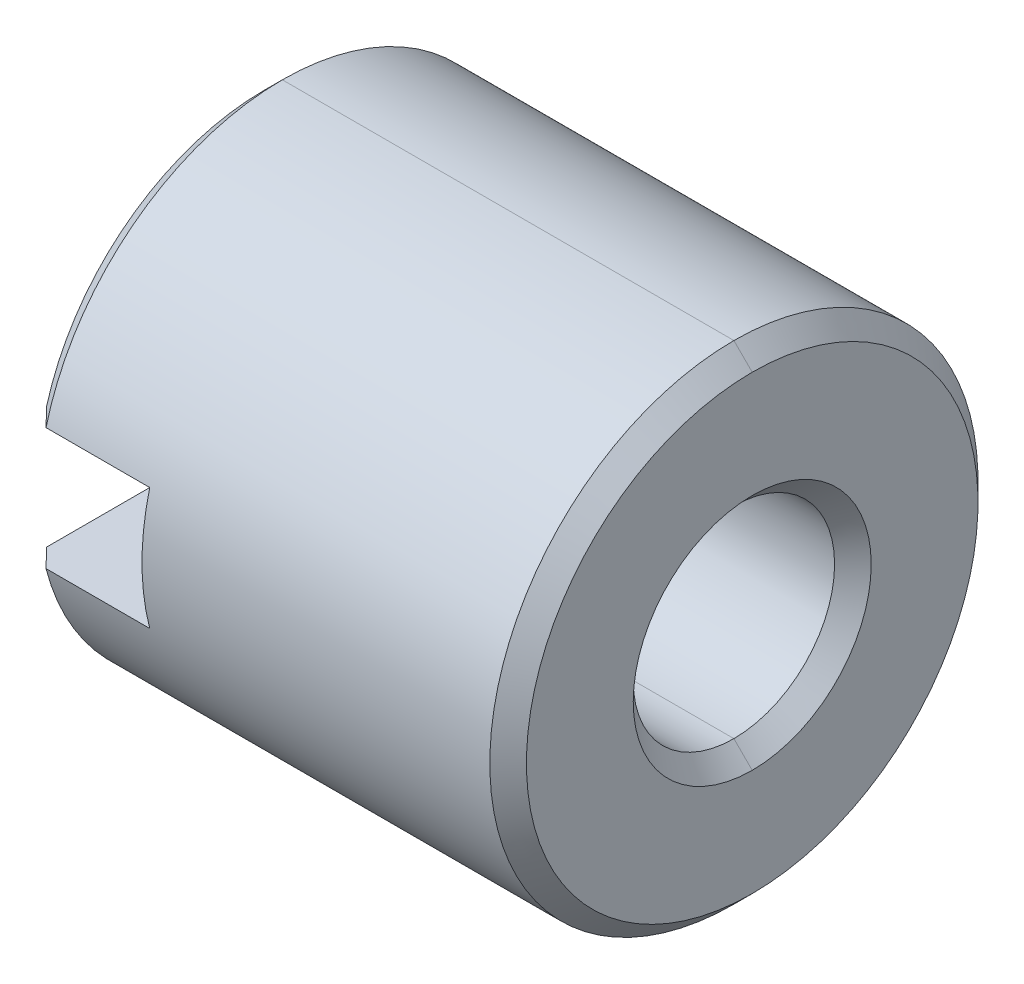
ISO-10303-21;
HEADER;
FILE_DESCRIPTION(('STEP AP214'),'2;1');
FILE_NAME('part.step','',(''),(''),'','','');
FILE_SCHEMA(('AUTOMOTIVE_DESIGN { 1 0 10303 214 1 1 1 1 }'));
ENDSEC;
DATA;
#1=APPLICATION_CONTEXT('core data for automotive mechanical design processes');
#2=APPLICATION_PROTOCOL_DEFINITION('international standard','automotive_design',2000,#1);
#3=PRODUCT_CONTEXT('',#1,'mechanical');
#4=PRODUCT('Part','Part','',(#3));
#5=PRODUCT_RELATED_PRODUCT_CATEGORY('part','',(#4));
#6=PRODUCT_DEFINITION_FORMATION('','',#4);
#7=PRODUCT_DEFINITION_CONTEXT('part definition',#1,'design');
#8=PRODUCT_DEFINITION('design','',#6,#7);
#9=PRODUCT_DEFINITION_SHAPE('','',#8);
#10=(LENGTH_UNIT() NAMED_UNIT(*) SI_UNIT(.MILLI.,.METRE.));
#11=(NAMED_UNIT(*) PLANE_ANGLE_UNIT() SI_UNIT($,.RADIAN.));
#12=(NAMED_UNIT(*) SI_UNIT($,.STERADIAN.) SOLID_ANGLE_UNIT());
#13=UNCERTAINTY_MEASURE_WITH_UNIT(LENGTH_MEASURE(1.E-05),#10,'distance_accuracy_value','');
#14=(GEOMETRIC_REPRESENTATION_CONTEXT(3) GLOBAL_UNCERTAINTY_ASSIGNED_CONTEXT((#13)) GLOBAL_UNIT_ASSIGNED_CONTEXT((#10,
#11,#12)) REPRESENTATION_CONTEXT('',''));
#15=CARTESIAN_POINT('',(0.,0.,0.));
#16=DIRECTION('',(0.,0.,1.));
#17=DIRECTION('',(1.,0.,0.));
#18=AXIS2_PLACEMENT_3D('',#15,#16,#17);
#19=CARTESIAN_POINT('',(7.849999999849,0.,0.));
#20=DIRECTION('',(1.,0.,0.));
#21=DIRECTION('',(0.,0.,-1.));
#22=AXIS2_PLACEMENT_3D('',#19,#20,#21);
#23=CONICAL_SURFACE('',#22,1.799999999849,0.7853981633973);
#24=DIRECTION('',(-0.707106781186548,-0.707106781186548,-8.47484993595657E-10));
#25=VECTOR('',#24,1.);
#26=CARTESIAN_POINT('',(7.999999999813,1.949999999813,9.840526496576E-10));
#27=LINE('',#26,#25);
#28=CARTESIAN_POINT('',(8.,1.95,0.));
#29=VERTEX_POINT('',#28);
#30=CARTESIAN_POINT('',(7.7,1.65,0.));
#31=VERTEX_POINT('',#30);
#32=EDGE_CURVE('P0_E251',#29,#31,#27,.T.);
#33=ORIENTED_EDGE('',*,*,#32,.T.);
#34=CARTESIAN_POINT('',(7.7,0.,0.));
#35=DIRECTION('',(-1.,0.,0.));
#36=DIRECTION('',(0.,1.,0.));
#37=AXIS2_PLACEMENT_3D('',#34,#35,#36);
#38=CIRCLE('',#37,1.65);
#39=CARTESIAN_POINT('',(7.7,-1.65,0.));
#40=VERTEX_POINT('',#39);
#41=EDGE_CURVE('P0_E244',#31,#40,#38,.T.);
#42=ORIENTED_EDGE('',*,*,#41,.T.);
#43=DIRECTION('',(-0.707106781186548,0.707106781186548,8.47486368665657E-10));
#44=VECTOR('',#43,1.);
#45=CARTESIAN_POINT('',(7.999999999813,-1.949999999813,-9.840536468787E-10));
#46=LINE('',#45,#44);
#47=CARTESIAN_POINT('',(8.,-1.95,0.));
#48=VERTEX_POINT('',#47);
#49=EDGE_CURVE('P0_E248',#48,#40,#46,.T.);
#50=ORIENTED_EDGE('',*,*,#49,.F.);
#51=CARTESIAN_POINT('',(8.,0.,0.));
#52=DIRECTION('',(-1.,0.,0.));
#53=DIRECTION('',(0.,1.,0.));
#54=AXIS2_PLACEMENT_3D('',#51,#52,#53);
#55=CIRCLE('',#54,1.95);
#56=EDGE_CURVE('P0_E350',#29,#48,#55,.T.);
#57=ORIENTED_EDGE('',*,*,#56,.F.);
#58=EDGE_LOOP('',(#33,#42,#50,#57));
#59=FACE_BOUND('',#58,.T.);
#60=ADVANCED_FACE('P0_F17',(#59),#23,.F.);
#61=CARTESIAN_POINT('',(7.850000000014,0.,0.));
#62=DIRECTION('',(-1.,0.,0.));
#63=DIRECTION('',(0.,0.,-1.));
#64=AXIS2_PLACEMENT_3D('',#61,#62,#63);
#65=CONICAL_SURFACE('',#64,3.849999999986,0.7853981633973);
#66=DIRECTION('',(-0.707106781186498,-0.707106781186597,2.22109323048799E-10));
#67=VECTOR('',#66,1.);
#68=CARTESIAN_POINT('',(8.000000000015,-3.699999999985,-4.980849783064E-10));
#69=LINE('',#68,#67);
#70=CARTESIAN_POINT('',(8.,-3.7,0.));
#71=VERTEX_POINT('',#70);
#72=CARTESIAN_POINT('',(7.7,-4.,0.));
#73=VERTEX_POINT('',#72);
#74=EDGE_CURVE('P0_E11',#71,#73,#69,.T.);
#75=ORIENTED_EDGE('',*,*,#74,.T.);
#76=CARTESIAN_POINT('',(7.7,0.,0.));
#77=DIRECTION('',(1.,0.,0.));
#78=DIRECTION('',(0.,-1.,0.));
#79=AXIS2_PLACEMENT_3D('',#76,#77,#78);
#80=CIRCLE('',#79,4.);
#81=CARTESIAN_POINT('',(7.7,4.,0.));
#82=VERTEX_POINT('',#81);
#83=EDGE_CURVE('P0_E318',#73,#82,#80,.T.);
#84=ORIENTED_EDGE('',*,*,#83,.T.);
#85=DIRECTION('',(-0.707106781186498,0.707106781186597,-2.22108939297799E-10));
#86=VECTOR('',#85,1.);
#87=CARTESIAN_POINT('',(8.000000000015,3.699999999985,4.980843596545E-10));
#88=LINE('',#87,#86);
#89=CARTESIAN_POINT('',(8.,3.7,0.));
#90=VERTEX_POINT('',#89);
#91=EDGE_CURVE('P0_E25',#90,#82,#88,.T.);
#92=ORIENTED_EDGE('',*,*,#91,.F.);
#93=CARTESIAN_POINT('',(8.,0.,0.));
#94=DIRECTION('',(1.,0.,0.));
#95=DIRECTION('',(0.,-1.,0.));
#96=AXIS2_PLACEMENT_3D('',#93,#94,#95);
#97=CIRCLE('',#96,3.7);
#98=EDGE_CURVE('P0_E283',#71,#90,#97,.T.);
#99=ORIENTED_EDGE('',*,*,#98,.F.);
#100=EDGE_LOOP('',(#75,#84,#92,#99));
#101=FACE_BOUND('',#100,.T.);
#102=ADVANCED_FACE('P0_F477',(#101),#65,.T.);
#103=CARTESIAN_POINT('',(7.850000000014,0.,0.));
#104=DIRECTION('',(-1.,0.,0.));
#105=DIRECTION('',(0.,0.,-1.));
#106=AXIS2_PLACEMENT_3D('',#103,#104,#105);
#107=CONICAL_SURFACE('',#106,3.849999999986,0.7853981633973);
#108=ORIENTED_EDGE('',*,*,#91,.T.);
#109=CARTESIAN_POINT('',(7.7,0.,0.));
#110=DIRECTION('',(1.,0.,0.));
#111=DIRECTION('',(0.,1.,0.));
#112=AXIS2_PLACEMENT_3D('',#109,#110,#111);
#113=CIRCLE('',#112,4.);
#114=EDGE_CURVE('P0_E292',#82,#73,#113,.T.);
#115=ORIENTED_EDGE('',*,*,#114,.T.);
#116=ORIENTED_EDGE('',*,*,#74,.F.);
#117=CARTESIAN_POINT('',(8.,0.,0.));
#118=DIRECTION('',(1.,0.,0.));
#119=DIRECTION('',(0.,1.,0.));
#120=AXIS2_PLACEMENT_3D('',#117,#118,#119);
#121=CIRCLE('',#120,3.7);
#122=EDGE_CURVE('P0_E300',#90,#71,#121,.T.);
#123=ORIENTED_EDGE('',*,*,#122,.F.);
#124=EDGE_LOOP('',(#108,#115,#116,#123));
#125=FACE_BOUND('',#124,.T.);
#126=ADVANCED_FACE('P0_F480',(#125),#107,.T.);
#127=CARTESIAN_POINT('',(8.,0.,0.));
#128=DIRECTION('',(1.,0.,0.));
#129=DIRECTION('',(0.,1.,0.));
#130=AXIS2_PLACEMENT_3D('',#127,#128,#129);
#131=PLANE('',#130);
#132=ORIENTED_EDGE('',*,*,#56,.T.);
#133=CARTESIAN_POINT('',(8.,0.,0.));
#134=DIRECTION('',(-1.,0.,0.));
#135=DIRECTION('',(0.,-1.,0.));
#136=AXIS2_PLACEMENT_3D('',#133,#134,#135);
#137=CIRCLE('',#136,1.95);
#138=EDGE_CURVE('P0_E279',#48,#29,#137,.T.);
#139=ORIENTED_EDGE('',*,*,#138,.T.);
#140=EDGE_LOOP('',(#132,#139));
#141=FACE_BOUND('',#140,.T.);
#142=ORIENTED_EDGE('',*,*,#98,.T.);
#143=ORIENTED_EDGE('',*,*,#122,.T.);
#144=EDGE_LOOP('',(#142,#143));
#145=FACE_BOUND('',#144,.T.);
#146=ADVANCED_FACE('P0_F479',(#141,#145),#131,.T.);
#147=CARTESIAN_POINT('',(7.849999999849,0.,0.));
#148=DIRECTION('',(1.,0.,0.));
#149=DIRECTION('',(0.,0.,-1.));
#150=AXIS2_PLACEMENT_3D('',#147,#148,#149);
#151=CONICAL_SURFACE('',#150,1.799999999849,0.7853981633973);
#152=ORIENTED_EDGE('',*,*,#49,.T.);
#153=CARTESIAN_POINT('',(7.7,0.,0.));
#154=DIRECTION('',(-1.,0.,0.));
#155=DIRECTION('',(0.,-1.,0.));
#156=AXIS2_PLACEMENT_3D('',#153,#154,#155);
#157=CIRCLE('',#156,1.65);
#158=EDGE_CURVE('P0_E252',#40,#31,#157,.T.);
#159=ORIENTED_EDGE('',*,*,#158,.T.);
#160=ORIENTED_EDGE('',*,*,#32,.F.);
#161=ORIENTED_EDGE('',*,*,#138,.F.);
#162=EDGE_LOOP('',(#152,#159,#160,#161));
#163=FACE_BOUND('',#162,.T.);
#164=ADVANCED_FACE('P0_F489',(#163),#151,.F.);
#165=CARTESIAN_POINT('',(-1.24,0.,0.));
#166=DIRECTION('',(1.,0.,0.));
#167=DIRECTION('',(0.,-1.,0.));
#168=AXIS2_PLACEMENT_3D('',#165,#166,#167);
#169=CYLINDRICAL_SURFACE('',#168,1.65);
#170=DIRECTION('',(1.,0.,0.));
#171=VECTOR('',#170,1.);
#172=CARTESIAN_POINT('',(0.3,1.,1.312440474841));
#173=LINE('',#172,#171);
#174=CARTESIAN_POINT('',(0.3,1.,1.312440474841));
#175=VERTEX_POINT('',#174);
#176=CARTESIAN_POINT('',(2.,1.,1.312440474841));
#177=VERTEX_POINT('',#176);
#178=EDGE_CURVE('P0_E310',#175,#177,#173,.T.);
#179=ORIENTED_EDGE('',*,*,#178,.F.);
#180=CARTESIAN_POINT('',(0.3,0.,0.));
#181=DIRECTION('',(1.,0.,0.));
#182=DIRECTION('',(0.,1.,0.));
#183=AXIS2_PLACEMENT_3D('',#180,#181,#182);
#184=CIRCLE('',#183,1.65);
#185=CARTESIAN_POINT('',(0.3000000000792,1.649999999921,4.163304253054E-10));
#186=VERTEX_POINT('',#185);
#187=EDGE_CURVE('P0_E264',#186,#175,#184,.T.);
#188=ORIENTED_EDGE('',*,*,#187,.F.);
#189=DIRECTION('',(1.,-5.354665659966E-12,2.813037741685E-11));
#190=VECTOR('',#189,1.);
#191=CARTESIAN_POINT('',(0.3000000000792,1.649999999921,4.163304253054E-10));
#192=LINE('',#191,#190);
#193=EDGE_CURVE('P0_E271',#186,#31,#192,.T.);
#194=ORIENTED_EDGE('',*,*,#193,.T.);
#195=ORIENTED_EDGE('',*,*,#158,.F.);
#196=DIRECTION('',(1.,5.354665659966E-12,-2.813040474616E-11));
#197=VECTOR('',#196,1.);
#198=CARTESIAN_POINT('',(0.3000000000792,-1.649999999921,-4.163306368968E-10));
#199=LINE('',#198,#197);
#200=CARTESIAN_POINT('',(0.3000000000792,-1.649999999921,-4.163306368968E-10));
#201=VERTEX_POINT('',#200);
#202=EDGE_CURVE('P0_E240',#201,#40,#199,.T.);
#203=ORIENTED_EDGE('',*,*,#202,.F.);
#204=CARTESIAN_POINT('',(0.3,0.,0.));
#205=DIRECTION('',(1.,0.,0.));
#206=DIRECTION('',(0.,-0.606060606060605,0.795418469600406));
#207=AXIS2_PLACEMENT_3D('',#204,#205,#206);
#208=CIRCLE('',#207,1.65);
#209=CARTESIAN_POINT('',(0.3,-1.,1.312440474841));
#210=VERTEX_POINT('',#209);
#211=EDGE_CURVE('P0_E228',#210,#201,#208,.T.);
#212=ORIENTED_EDGE('',*,*,#211,.F.);
#213=DIRECTION('',(1.,0.,0.));
#214=VECTOR('',#213,1.);
#215=CARTESIAN_POINT('',(0.3,-1.,1.312440474841));
#216=LINE('',#215,#214);
#217=CARTESIAN_POINT('',(2.,-1.,1.312440474841));
#218=VERTEX_POINT('',#217);
#219=EDGE_CURVE('P0_E367',#210,#218,#216,.T.);
#220=ORIENTED_EDGE('',*,*,#219,.T.);
#221=CARTESIAN_POINT('',(2.,0.,0.));
#222=DIRECTION('',(1.,0.,0.));
#223=DIRECTION('',(0.,0.606060606060605,0.795418469600406));
#224=AXIS2_PLACEMENT_3D('',#221,#222,#223);
#225=CIRCLE('',#224,1.65);
#226=EDGE_CURVE('P0_E235',#177,#218,#225,.T.);
#227=ORIENTED_EDGE('',*,*,#226,.F.);
#228=EDGE_LOOP('',(#179,#188,#194,#195,#203,#212,#220,#227));
#229=FACE_BOUND('',#228,.T.);
#230=ADVANCED_FACE('P0_F462',(#229),#169,.F.);
#231=CARTESIAN_POINT('',(0.,1.,3.872983346207));
#232=DIRECTION('',(0.,1.,0.));
#233=DIRECTION('',(1.,0.,0.));
#234=AXIS2_PLACEMENT_3D('',#231,#232,#233);
#235=PLANE('',#234);
#236=CARTESIAN_POINT('',(0.3,1.,-3.872983346207));
#237=CARTESIAN_POINT('',(0.2657697355043,1.,-3.837630481053));
#238=CARTESIAN_POINT('',(0.1979063060679,1.,-3.767480929232));
#239=CARTESIAN_POINT('',(0.09791173359971,1.,-3.663929218604));
#240=CARTESIAN_POINT('',(0.03243796597576,1.,-3.595994450391));
#241=CARTESIAN_POINT('',(0.,1.,-3.562302626111));
#242=(BOUNDED_CURVE() B_SPLINE_CURVE(3,(#236,#237,#238,#239,#240,#241),.UNSPECIFIED.,.F.,
.F.) B_SPLINE_CURVE_WITH_KNOTS((4,1,1,4),(0.,0.3333333333333,0.6666666666667,1.),
.UNSPECIFIED.) CURVE() GEOMETRIC_REPRESENTATION_ITEM() RATIONAL_B_SPLINE_CURVE((1.,1.,1.,1.,1.,1.)) REPRESENTATION_ITEM(''));
#243=CARTESIAN_POINT('',(0.3,1.,-3.872983346207));
#244=VERTEX_POINT('',#243);
#245=CARTESIAN_POINT('',(0.,1.,-3.562302626111));
#246=VERTEX_POINT('',#245);
#247=EDGE_CURVE('P0_E328',#244,#246,#242,.T.);
#248=ORIENTED_EDGE('',*,*,#247,.F.);
#249=DIRECTION('',(1.,0.,0.));
#250=VECTOR('',#249,1.);
#251=CARTESIAN_POINT('',(0.3,1.,-3.872983346207));
#252=LINE('',#251,#250);
#253=CARTESIAN_POINT('',(2.,1.,-3.872983346207));
#254=VERTEX_POINT('',#253);
#255=EDGE_CURVE('P0_E303',#244,#254,#252,.T.);
#256=ORIENTED_EDGE('',*,*,#255,.T.);
#257=DIRECTION('',(0.,0.,-1.));
#258=VECTOR('',#257,1.);
#259=CARTESIAN_POINT('',(2.,1.,-1.312440474841));
#260=LINE('',#259,#258);
#261=CARTESIAN_POINT('',(2.,1.,-1.312440474841));
#262=VERTEX_POINT('',#261);
#263=EDGE_CURVE('P0_E190',#262,#254,#260,.T.);
#264=ORIENTED_EDGE('',*,*,#263,.F.);
#265=DIRECTION('',(1.,0.,0.));
#266=VECTOR('',#265,1.);
#267=CARTESIAN_POINT('',(0.3,1.,-1.312440474841));
#268=LINE('',#267,#266);
#269=CARTESIAN_POINT('',(0.3,1.,-1.312440474841));
#270=VERTEX_POINT('',#269);
#271=EDGE_CURVE('P0_E275',#270,#262,#268,.T.);
#272=ORIENTED_EDGE('',*,*,#271,.F.);
#273=CARTESIAN_POINT('',(0.3,1.,-1.312440474841));
#274=CARTESIAN_POINT('',(0.2700144693865,1.,-1.350138280159));
#275=CARTESIAN_POINT('',(0.207791121413,1.,-1.427171375861));
#276=CARTESIAN_POINT('',(0.1078224656772,1.,-1.547611652264));
#277=CARTESIAN_POINT('',(0.03667734501383,1.,-1.631344105928));
#278=CARTESIAN_POINT('',(0.,1.,-1.674066904278));
#279=(BOUNDED_CURVE() B_SPLINE_CURVE(3,(#273,#274,#275,#276,#277,#278),.UNSPECIFIED.,.F.,
.F.) B_SPLINE_CURVE_WITH_KNOTS((4,1,1,4),(0.,0.3333333333333,0.6666666666667,1.),
.UNSPECIFIED.) CURVE() GEOMETRIC_REPRESENTATION_ITEM() RATIONAL_B_SPLINE_CURVE((1.,1.,1.,1.,1.,1.)) REPRESENTATION_ITEM(''));
#280=CARTESIAN_POINT('',(0.,1.,-1.674066904278));
#281=VERTEX_POINT('',#280);
#282=EDGE_CURVE('P0_E247',#270,#281,#279,.T.);
#283=ORIENTED_EDGE('',*,*,#282,.T.);
#284=DIRECTION('',(0.,0.,-1.));
#285=VECTOR('',#284,1.);
#286=CARTESIAN_POINT('',(0.,1.,-1.674066904278));
#287=LINE('',#286,#285);
#288=EDGE_CURVE('P0_E417',#281,#246,#287,.T.);
#289=ORIENTED_EDGE('',*,*,#288,.T.);
#290=EDGE_LOOP('',(#248,#256,#264,#272,#283,#289));
#291=FACE_BOUND('',#290,.T.);
#292=ADVANCED_FACE('P0_F470',(#291),#235,.F.);
#293=CARTESIAN_POINT('',(0.,1.,3.872983346207));
#294=DIRECTION('',(0.,1.,0.));
#295=DIRECTION('',(1.,0.,0.));
#296=AXIS2_PLACEMENT_3D('',#293,#294,#295);
#297=PLANE('',#296);
#298=CARTESIAN_POINT('',(0.,1.,1.674066904278));
#299=CARTESIAN_POINT('',(0.03660845489877,1.,1.631424351062));
#300=CARTESIAN_POINT('',(0.1076635162363,1.,1.547800174312));
#301=CARTESIAN_POINT('',(0.2076454283079,1.,1.427349857706));
#302=CARTESIAN_POINT('',(0.2699530564767,1.,1.350215488461));
#303=CARTESIAN_POINT('',(0.3,1.,1.312440474841));
#304=(BOUNDED_CURVE() B_SPLINE_CURVE(3,(#298,#299,#300,#301,#302,#303),.UNSPECIFIED.,.F.,
.F.) B_SPLINE_CURVE_WITH_KNOTS((4,1,1,4),(0.,0.3333333333333,0.6666666666667,1.),
.UNSPECIFIED.) CURVE() GEOMETRIC_REPRESENTATION_ITEM() RATIONAL_B_SPLINE_CURVE((1.,1.,1.,1.,1.,1.)) REPRESENTATION_ITEM(''));
#305=CARTESIAN_POINT('',(0.,1.,1.674066904278));
#306=VERTEX_POINT('',#305);
#307=EDGE_CURVE('P0_E219',#306,#175,#304,.T.);
#308=ORIENTED_EDGE('',*,*,#307,.T.);
#309=ORIENTED_EDGE('',*,*,#178,.T.);
#310=DIRECTION('',(0.,0.,-1.));
#311=VECTOR('',#310,1.);
#312=CARTESIAN_POINT('',(2.,1.,3.872983346207));
#313=LINE('',#312,#311);
#314=CARTESIAN_POINT('',(2.,1.,3.872983346207));
#315=VERTEX_POINT('',#314);
#316=EDGE_CURVE('P0_E194',#315,#177,#313,.T.);
#317=ORIENTED_EDGE('',*,*,#316,.F.);
#318=DIRECTION('',(1.,0.,0.));
#319=VECTOR('',#318,1.);
#320=CARTESIAN_POINT('',(0.3,1.,3.872983346207));
#321=LINE('',#320,#319);
#322=CARTESIAN_POINT('',(0.3,1.,3.872983346207));
#323=VERTEX_POINT('',#322);
#324=EDGE_CURVE('P0_E346',#323,#315,#321,.T.);
#325=ORIENTED_EDGE('',*,*,#324,.F.);
#326=CARTESIAN_POINT('',(0.,1.,3.562302626111));
#327=CARTESIAN_POINT('',(0.03242757693032,1.,3.595983659767));
#328=CARTESIAN_POINT('',(0.09788746578101,1.,3.663904056762));
#329=CARTESIAN_POINT('',(0.1978816035343,1.,3.767455378529));
#330=CARTESIAN_POINT('',(0.2657591385284,1.,3.837619536544));
#331=CARTESIAN_POINT('',(0.3,1.,3.872983346207));
#332=(BOUNDED_CURVE() B_SPLINE_CURVE(3,(#326,#327,#328,#329,#330,#331),.UNSPECIFIED.,.F.,
.F.) B_SPLINE_CURVE_WITH_KNOTS((4,1,1,4),(0.,0.3333333333333,0.6666666666667,1.),
.UNSPECIFIED.) CURVE() GEOMETRIC_REPRESENTATION_ITEM() RATIONAL_B_SPLINE_CURVE((1.,1.,1.,1.,1.,1.)) REPRESENTATION_ITEM(''));
#333=CARTESIAN_POINT('',(0.,1.,3.562302626111));
#334=VERTEX_POINT('',#333);
#335=EDGE_CURVE('P0_E293',#334,#323,#332,.T.);
#336=ORIENTED_EDGE('',*,*,#335,.F.);
#337=DIRECTION('',(0.,0.,-1.));
#338=VECTOR('',#337,1.);
#339=CARTESIAN_POINT('',(0.,1.,3.562302626111));
#340=LINE('',#339,#338);
#341=EDGE_CURVE('P0_E427',#334,#306,#340,.T.);
#342=ORIENTED_EDGE('',*,*,#341,.T.);
#343=EDGE_LOOP('',(#308,#309,#317,#325,#336,#342));
#344=FACE_BOUND('',#343,.T.);
#345=ADVANCED_FACE('P0_F458',(#344),#297,.F.);
#346=CARTESIAN_POINT('',(0.,0.,0.));
#347=DIRECTION('',(1.,0.,0.));
#348=DIRECTION('',(0.,-1.,0.));
#349=AXIS2_PLACEMENT_3D('',#346,#347,#348);
#350=CYLINDRICAL_SURFACE('',#349,4.);
#351=DIRECTION('',(1.,0.,0.));
#352=VECTOR('',#351,1.);
#353=CARTESIAN_POINT('',(0.3,-1.,3.872983346207));
#354=LINE('',#353,#352);
#355=CARTESIAN_POINT('',(0.3,-1.,3.872983346207));
#356=VERTEX_POINT('',#355);
#357=CARTESIAN_POINT('',(2.,-1.,3.872983346207));
#358=VERTEX_POINT('',#357);
#359=EDGE_CURVE('P0_E434',#356,#358,#354,.T.);
#360=ORIENTED_EDGE('',*,*,#359,.F.);
#361=CARTESIAN_POINT('',(0.3,0.,0.));
#362=DIRECTION('',(-1.,0.,0.));
#363=DIRECTION('',(0.,-1.,0.));
#364=AXIS2_PLACEMENT_3D('',#361,#362,#363);
#365=CIRCLE('',#364,4.);
#366=CARTESIAN_POINT('',(0.299999999992,-3.999999999992,-2.692331161465E-10));
#367=VERTEX_POINT('',#366);
#368=EDGE_CURVE('P0_E325',#367,#356,#365,.T.);
#369=ORIENTED_EDGE('',*,*,#368,.F.);
#370=DIRECTION('',(1.,5.372279198064E-13,-1.819173744096E-11));
#371=VECTOR('',#370,1.);
#372=CARTESIAN_POINT('',(0.299999999992,-3.999999999992,-2.692331161465E-10));
#373=LINE('',#372,#371);
#374=EDGE_CURVE('P0_E321',#367,#73,#373,.T.);
#375=ORIENTED_EDGE('',*,*,#374,.T.);
#376=ORIENTED_EDGE('',*,*,#114,.F.);
#377=DIRECTION('',(1.,-5.372279198064E-13,1.819143579272E-11));
#378=VECTOR('',#377,1.);
#379=CARTESIAN_POINT('',(0.299999999992,3.999999999992,2.692348925033E-10));
#380=LINE('',#379,#378);
#381=CARTESIAN_POINT('',(0.299999999992,3.999999999992,2.692348925033E-10));
#382=VERTEX_POINT('',#381);
#383=EDGE_CURVE('P0_E314',#382,#82,#380,.T.);
#384=ORIENTED_EDGE('',*,*,#383,.F.);
#385=CARTESIAN_POINT('',(0.3,0.,0.));
#386=DIRECTION('',(-1.,0.,0.));
#387=DIRECTION('',(0.,0.249999999999989,0.968245836551857));
#388=AXIS2_PLACEMENT_3D('',#385,#386,#387);
#389=CIRCLE('',#388,4.);
#390=EDGE_CURVE('P0_E289',#323,#382,#389,.T.);
#391=ORIENTED_EDGE('',*,*,#390,.F.);
#392=ORIENTED_EDGE('',*,*,#324,.T.);
#393=CARTESIAN_POINT('',(2.,0.,0.));
#394=DIRECTION('',(1.,0.,0.));
#395=DIRECTION('',(0.,0.249999999999989,0.968245836551857));
#396=AXIS2_PLACEMENT_3D('',#393,#394,#395);
#397=CIRCLE('',#396,4.);
#398=EDGE_CURVE('P0_E296',#315,#358,#397,.T.);
#399=ORIENTED_EDGE('',*,*,#398,.T.);
#400=EDGE_LOOP('',(#360,#369,#375,#376,#384,#391,#392,#399));
#401=FACE_BOUND('',#400,.T.);
#402=ADVANCED_FACE('P0_F453',(#401),#350,.T.);
#403=CARTESIAN_POINT('',(0.15,0.,0.));
#404=DIRECTION('',(1.,0.,0.));
#405=DIRECTION('',(0.,0.,-1.));
#406=AXIS2_PLACEMENT_3D('',#403,#404,#405);
#407=CONICAL_SURFACE('',#406,3.85,0.7853981633973);
#408=ORIENTED_EDGE('',*,*,#247,.T.);
#409=CARTESIAN_POINT('',(0.,0.,0.));
#410=DIRECTION('',(-1.,0.,0.));
#411=DIRECTION('',(0.,0.270270270270301,0.962784493543606));
#412=AXIS2_PLACEMENT_3D('',#409,#410,#411);
#413=CIRCLE('',#412,3.7);
#414=EDGE_CURVE('P0_E402',#334,#246,#413,.T.);
#415=ORIENTED_EDGE('',*,*,#414,.F.);
#416=ORIENTED_EDGE('',*,*,#335,.T.);
#417=ORIENTED_EDGE('',*,*,#390,.T.);
#418=CARTESIAN_POINT('',(0.3,0.,0.));
#419=DIRECTION('',(-1.,0.,0.));
#420=DIRECTION('',(0.,1.,0.));
#421=AXIS2_PLACEMENT_3D('',#418,#419,#420);
#422=CIRCLE('',#421,4.);
#423=EDGE_CURVE('P0_E306',#382,#244,#422,.T.);
#424=ORIENTED_EDGE('',*,*,#423,.T.);
#425=EDGE_LOOP('',(#408,#415,#416,#417,#424));
#426=FACE_BOUND('',#425,.T.);
#427=ADVANCED_FACE('P0_F475',(#426),#407,.T.);
#428=CARTESIAN_POINT('',(0.15,0.,0.));
#429=DIRECTION('',(1.,0.,0.));
#430=DIRECTION('',(0.,0.,-1.));
#431=AXIS2_PLACEMENT_3D('',#428,#429,#430);
#432=CONICAL_SURFACE('',#431,3.85,0.7853981633973);
#433=CARTESIAN_POINT('',(0.,-1.,-3.562302626111));
#434=CARTESIAN_POINT('',(0.03242757693032,-1.,-3.595983659767));
#435=CARTESIAN_POINT('',(0.09788746578101,-1.,-3.663904056762));
#436=CARTESIAN_POINT('',(0.1978816035343,-1.,-3.767455378529));
#437=CARTESIAN_POINT('',(0.2657591385284,-1.,-3.837619536544));
#438=CARTESIAN_POINT('',(0.3,-1.,-3.872983346207));
#439=(BOUNDED_CURVE() B_SPLINE_CURVE(3,(#433,#434,#435,#436,#437,#438),.UNSPECIFIED.,.F.,
.F.) B_SPLINE_CURVE_WITH_KNOTS((4,1,1,4),(0.,0.3333333333333,0.6666666666667,1.),
.UNSPECIFIED.) CURVE() GEOMETRIC_REPRESENTATION_ITEM() RATIONAL_B_SPLINE_CURVE((1.,1.,1.,1.,1.,1.)) REPRESENTATION_ITEM(''));
#440=CARTESIAN_POINT('',(0.,-1.,-3.562302626111));
#441=VERTEX_POINT('',#440);
#442=CARTESIAN_POINT('',(0.3,-1.,-3.872983346207));
#443=VERTEX_POINT('',#442);
#444=EDGE_CURVE('P0_E205',#441,#443,#439,.T.);
#445=ORIENTED_EDGE('',*,*,#444,.T.);
#446=CARTESIAN_POINT('',(0.3,0.,0.));
#447=DIRECTION('',(-1.,0.,0.));
#448=DIRECTION('',(0.,-0.249999999999989,-0.968245836551857));
#449=AXIS2_PLACEMENT_3D('',#446,#447,#448);
#450=CIRCLE('',#449,4.);
#451=EDGE_CURVE('P0_E201',#443,#367,#450,.T.);
#452=ORIENTED_EDGE('',*,*,#451,.T.);
#453=ORIENTED_EDGE('',*,*,#368,.T.);
#454=CARTESIAN_POINT('',(0.3,-1.,3.872983346207));
#455=CARTESIAN_POINT('',(0.2657697355043,-1.,3.837630481053));
#456=CARTESIAN_POINT('',(0.1979063060679,-1.,3.767480929232));
#457=CARTESIAN_POINT('',(0.09791173359971,-1.,3.663929218604));
#458=CARTESIAN_POINT('',(0.03243796597576,-1.,3.595994450391));
#459=CARTESIAN_POINT('',(0.,-1.,3.562302626111));
#460=(BOUNDED_CURVE() B_SPLINE_CURVE(3,(#454,#455,#456,#457,#458,#459),.UNSPECIFIED.,.F.,
.F.) B_SPLINE_CURVE_WITH_KNOTS((4,1,1,4),(0.,0.3333333333333,0.6666666666667,1.),
.UNSPECIFIED.) CURVE() GEOMETRIC_REPRESENTATION_ITEM() RATIONAL_B_SPLINE_CURVE((1.,1.,1.,1.,1.,1.)) REPRESENTATION_ITEM(''));
#461=CARTESIAN_POINT('',(0.,-1.,3.562302626111));
#462=VERTEX_POINT('',#461);
#463=EDGE_CURVE('P0_E433',#356,#462,#460,.T.);
#464=ORIENTED_EDGE('',*,*,#463,.T.);
#465=CARTESIAN_POINT('',(0.,0.,0.));
#466=DIRECTION('',(-1.,0.,0.));
#467=DIRECTION('',(0.,-0.270270270270301,-0.962784493543606));
#468=AXIS2_PLACEMENT_3D('',#465,#466,#467);
#469=CIRCLE('',#468,3.7);
#470=EDGE_CURVE('P0_E400',#441,#462,#469,.T.);
#471=ORIENTED_EDGE('',*,*,#470,.F.);
#472=EDGE_LOOP('',(#445,#452,#453,#464,#471));
#473=FACE_BOUND('',#472,.T.);
#474=ADVANCED_FACE('P0_F532',(#473),#432,.T.);
#475=CARTESIAN_POINT('',(0.,0.,0.));
#476=DIRECTION('',(1.,0.,0.));
#477=DIRECTION('',(0.,-1.,0.));
#478=AXIS2_PLACEMENT_3D('',#475,#476,#477);
#479=CYLINDRICAL_SURFACE('',#478,4.);
#480=ORIENTED_EDGE('',*,*,#255,.F.);
#481=ORIENTED_EDGE('',*,*,#423,.F.);
#482=ORIENTED_EDGE('',*,*,#383,.T.);
#483=ORIENTED_EDGE('',*,*,#83,.F.);
#484=ORIENTED_EDGE('',*,*,#374,.F.);
#485=ORIENTED_EDGE('',*,*,#451,.F.);
#486=DIRECTION('',(1.,0.,0.));
#487=VECTOR('',#486,1.);
#488=CARTESIAN_POINT('',(0.3,-1.,-3.872983346207));
#489=LINE('',#488,#487);
#490=CARTESIAN_POINT('',(2.,-1.,-3.872983346207));
#491=VERTEX_POINT('',#490);
#492=EDGE_CURVE('P0_E197',#443,#491,#489,.T.);
#493=ORIENTED_EDGE('',*,*,#492,.T.);
#494=CARTESIAN_POINT('',(2.,0.,0.));
#495=DIRECTION('',(1.,0.,0.));
#496=DIRECTION('',(0.,-0.249999999999989,-0.968245836551857));
#497=AXIS2_PLACEMENT_3D('',#494,#495,#496);
#498=CIRCLE('',#497,4.);
#499=EDGE_CURVE('P0_E183',#491,#254,#498,.T.);
#500=ORIENTED_EDGE('',*,*,#499,.T.);
#501=EDGE_LOOP('',(#480,#481,#482,#483,#484,#485,#493,#500));
#502=FACE_BOUND('',#501,.T.);
#503=ADVANCED_FACE('P0_F198',(#502),#479,.T.);
#504=CARTESIAN_POINT('',(2.,0.,0.));
#505=DIRECTION('',(-1.,0.,0.));
#506=DIRECTION('',(0.,0.,1.));
#507=AXIS2_PLACEMENT_3D('',#504,#505,#506);
#508=PLANE('',#507);
#509=ORIENTED_EDGE('',*,*,#316,.T.);
#510=ORIENTED_EDGE('',*,*,#226,.T.);
#511=DIRECTION('',(0.,0.,1.));
#512=VECTOR('',#511,1.);
#513=CARTESIAN_POINT('',(2.,-1.,1.312440474841));
#514=LINE('',#513,#512);
#515=EDGE_CURVE('P0_E370',#218,#358,#514,.T.);
#516=ORIENTED_EDGE('',*,*,#515,.T.);
#517=ORIENTED_EDGE('',*,*,#398,.F.);
#518=EDGE_LOOP('',(#509,#510,#516,#517));
#519=FACE_BOUND('',#518,.T.);
#520=ADVANCED_FACE('P0_F448',(#519),#508,.T.);
#521=CARTESIAN_POINT('',(2.,0.,0.));
#522=DIRECTION('',(-1.,0.,0.));
#523=DIRECTION('',(0.,0.,1.));
#524=AXIS2_PLACEMENT_3D('',#521,#522,#523);
#525=PLANE('',#524);
#526=DIRECTION('',(0.,0.,1.));
#527=VECTOR('',#526,1.);
#528=CARTESIAN_POINT('',(2.,-1.,-3.872983346207));
#529=LINE('',#528,#527);
#530=CARTESIAN_POINT('',(2.,-1.,-1.312440474841));
#531=VERTEX_POINT('',#530);
#532=EDGE_CURVE('P0_E188',#491,#531,#529,.T.);
#533=ORIENTED_EDGE('',*,*,#532,.T.);
#534=CARTESIAN_POINT('',(2.,0.,0.));
#535=DIRECTION('',(1.,0.,0.));
#536=DIRECTION('',(0.,-0.606060606060605,-0.795418469600406));
#537=AXIS2_PLACEMENT_3D('',#534,#535,#536);
#538=CIRCLE('',#537,1.65);
#539=EDGE_CURVE('P0_E272',#531,#262,#538,.T.);
#540=ORIENTED_EDGE('',*,*,#539,.T.);
#541=ORIENTED_EDGE('',*,*,#263,.T.);
#542=ORIENTED_EDGE('',*,*,#499,.F.);
#543=EDGE_LOOP('',(#533,#540,#541,#542));
#544=FACE_BOUND('',#543,.T.);
#545=ADVANCED_FACE('P0_F185',(#544),#525,.T.);
#546=CARTESIAN_POINT('',(-1.24,0.,0.));
#547=DIRECTION('',(1.,0.,0.));
#548=DIRECTION('',(0.,-1.,0.));
#549=AXIS2_PLACEMENT_3D('',#546,#547,#548);
#550=CYLINDRICAL_SURFACE('',#549,1.65);
#551=DIRECTION('',(1.,0.,0.));
#552=VECTOR('',#551,1.);
#553=CARTESIAN_POINT('',(0.3,-1.,-1.312440474841));
#554=LINE('',#553,#552);
#555=CARTESIAN_POINT('',(0.3,-1.,-1.312440474841));
#556=VERTEX_POINT('',#555);
#557=EDGE_CURVE('P0_E210',#556,#531,#554,.T.);
#558=ORIENTED_EDGE('',*,*,#557,.F.);
#559=CARTESIAN_POINT('',(0.3,0.,0.));
#560=DIRECTION('',(1.,0.,0.));
#561=DIRECTION('',(0.,-1.,0.));
#562=AXIS2_PLACEMENT_3D('',#559,#560,#561);
#563=CIRCLE('',#562,1.65);
#564=EDGE_CURVE('P0_E239',#201,#556,#563,.T.);
#565=ORIENTED_EDGE('',*,*,#564,.F.);
#566=ORIENTED_EDGE('',*,*,#202,.T.);
#567=ORIENTED_EDGE('',*,*,#41,.F.);
#568=ORIENTED_EDGE('',*,*,#193,.F.);
#569=CARTESIAN_POINT('',(0.3,0.,0.));
#570=DIRECTION('',(1.,0.,0.));
#571=DIRECTION('',(0.,0.606060606060605,-0.795418469600406));
#572=AXIS2_PLACEMENT_3D('',#569,#570,#571);
#573=CIRCLE('',#572,1.65);
#574=EDGE_CURVE('P0_E257',#270,#186,#573,.T.);
#575=ORIENTED_EDGE('',*,*,#574,.F.);
#576=ORIENTED_EDGE('',*,*,#271,.T.);
#577=ORIENTED_EDGE('',*,*,#539,.F.);
#578=EDGE_LOOP('',(#558,#565,#566,#567,#568,#575,#576,#577));
#579=FACE_BOUND('',#578,.T.);
#580=ADVANCED_FACE('P0_F466',(#579),#550,.F.);
#581=CARTESIAN_POINT('',(0.1500000001189,0.,0.));
#582=DIRECTION('',(-1.,0.,0.));
#583=DIRECTION('',(0.,0.,-1.));
#584=AXIS2_PLACEMENT_3D('',#581,#582,#583);
#585=CONICAL_SURFACE('',#584,1.799999999881,0.7853981633973);
#586=ORIENTED_EDGE('',*,*,#282,.F.);
#587=ORIENTED_EDGE('',*,*,#574,.T.);
#588=ORIENTED_EDGE('',*,*,#187,.T.);
#589=ORIENTED_EDGE('',*,*,#307,.F.);
#590=CARTESIAN_POINT('',(0.,0.,0.));
#591=DIRECTION('',(1.,0.,0.));
#592=DIRECTION('',(0.,0.512820512820484,-0.858495848347874));
#593=AXIS2_PLACEMENT_3D('',#590,#591,#592);
#594=CIRCLE('',#593,1.95);
#595=EDGE_CURVE('P0_E423',#281,#306,#594,.T.);
#596=ORIENTED_EDGE('',*,*,#595,.F.);
#597=EDGE_LOOP('',(#586,#587,#588,#589,#596));
#598=FACE_BOUND('',#597,.T.);
#599=ADVANCED_FACE('P0_F502',(#598),#585,.F.);
#600=CARTESIAN_POINT('',(0.1500000001189,0.,0.));
#601=DIRECTION('',(-1.,0.,0.));
#602=DIRECTION('',(0.,0.,-1.));
#603=AXIS2_PLACEMENT_3D('',#600,#601,#602);
#604=CONICAL_SURFACE('',#603,1.799999999881,0.7853981633973);
#605=CARTESIAN_POINT('',(0.,-1.,-1.674066904278));
#606=CARTESIAN_POINT('',(0.03660845489877,-1.,-1.631424351062));
#607=CARTESIAN_POINT('',(0.1076635162363,-1.,-1.547800174312));
#608=CARTESIAN_POINT('',(0.2076454283079,-1.,-1.427349857706));
#609=CARTESIAN_POINT('',(0.2699530564767,-1.,-1.350215488461));
#610=CARTESIAN_POINT('',(0.3,-1.,-1.312440474841));
#611=(BOUNDED_CURVE() B_SPLINE_CURVE(3,(#605,#606,#607,#608,#609,#610),.UNSPECIFIED.,.F.,
.F.) B_SPLINE_CURVE_WITH_KNOTS((4,1,1,4),(0.,0.3333333333333,0.6666666666667,1.),
.UNSPECIFIED.) CURVE() GEOMETRIC_REPRESENTATION_ITEM() RATIONAL_B_SPLINE_CURVE((1.,1.,1.,1.,1.,1.)) REPRESENTATION_ITEM(''));
#612=CARTESIAN_POINT('',(0.,-1.,-1.674066904278));
#613=VERTEX_POINT('',#612);
#614=EDGE_CURVE('P0_E216',#613,#556,#611,.T.);
#615=ORIENTED_EDGE('',*,*,#614,.F.);
#616=CARTESIAN_POINT('',(0.,0.,0.));
#617=DIRECTION('',(1.,0.,0.));
#618=DIRECTION('',(0.,-0.512820512820484,0.858495848347874));
#619=AXIS2_PLACEMENT_3D('',#616,#617,#618);
#620=CIRCLE('',#619,1.95);
#621=CARTESIAN_POINT('',(0.,-1.,1.674066904278));
#622=VERTEX_POINT('',#621);
#623=EDGE_CURVE('P0_E398',#622,#613,#620,.T.);
#624=ORIENTED_EDGE('',*,*,#623,.F.);
#625=CARTESIAN_POINT('',(0.3,-1.,1.312440474841));
#626=CARTESIAN_POINT('',(0.2700144693865,-1.,1.350138280159));
#627=CARTESIAN_POINT('',(0.207791121413,-1.,1.427171375861));
#628=CARTESIAN_POINT('',(0.1078224656772,-1.,1.547611652264));
#629=CARTESIAN_POINT('',(0.03667734501383,-1.,1.631344105928));
#630=CARTESIAN_POINT('',(0.,-1.,1.674066904278));
#631=(BOUNDED_CURVE() B_SPLINE_CURVE(3,(#625,#626,#627,#628,#629,#630),.UNSPECIFIED.,.F.,
.F.) B_SPLINE_CURVE_WITH_KNOTS((4,1,1,4),(0.,0.3333333333333,0.6666666666667,1.),
.UNSPECIFIED.) CURVE() GEOMETRIC_REPRESENTATION_ITEM() RATIONAL_B_SPLINE_CURVE((1.,1.,1.,1.,1.,1.)) REPRESENTATION_ITEM(''));
#632=EDGE_CURVE('P0_E363',#210,#622,#631,.T.);
#633=ORIENTED_EDGE('',*,*,#632,.F.);
#634=ORIENTED_EDGE('',*,*,#211,.T.);
#635=ORIENTED_EDGE('',*,*,#564,.T.);
#636=EDGE_LOOP('',(#615,#624,#633,#634,#635));
#637=FACE_BOUND('',#636,.T.);
#638=ADVANCED_FACE('P0_F404',(#637),#604,.F.);
#639=CARTESIAN_POINT('',(0.,-1.,-3.872983346207));
#640=DIRECTION('',(0.,-1.,0.));
#641=DIRECTION('',(0.,0.,-1.));
#642=AXIS2_PLACEMENT_3D('',#639,#640,#641);
#643=PLANE('',#642);
#644=ORIENTED_EDGE('',*,*,#614,.T.);
#645=ORIENTED_EDGE('',*,*,#557,.T.);
#646=ORIENTED_EDGE('',*,*,#532,.F.);
#647=ORIENTED_EDGE('',*,*,#492,.F.);
#648=ORIENTED_EDGE('',*,*,#444,.F.);
#649=DIRECTION('',(0.,0.,-1.));
#650=VECTOR('',#649,1.);
#651=CARTESIAN_POINT('',(0.,-1.,-1.674066904278));
#652=LINE('',#651,#650);
#653=EDGE_CURVE('P0_E406',#613,#441,#652,.T.);
#654=ORIENTED_EDGE('',*,*,#653,.F.);
#655=EDGE_LOOP('',(#644,#645,#646,#647,#648,#654));
#656=FACE_BOUND('',#655,.T.);
#657=ADVANCED_FACE('P0_F208',(#656),#643,.F.);
#658=CARTESIAN_POINT('',(0.,-1.,-3.872983346207));
#659=DIRECTION('',(0.,-1.,0.));
#660=DIRECTION('',(0.,0.,-1.));
#661=AXIS2_PLACEMENT_3D('',#658,#659,#660);
#662=PLANE('',#661);
#663=ORIENTED_EDGE('',*,*,#463,.F.);
#664=ORIENTED_EDGE('',*,*,#359,.T.);
#665=ORIENTED_EDGE('',*,*,#515,.F.);
#666=ORIENTED_EDGE('',*,*,#219,.F.);
#667=ORIENTED_EDGE('',*,*,#632,.T.);
#668=DIRECTION('',(0.,0.,-1.));
#669=VECTOR('',#668,1.);
#670=CARTESIAN_POINT('',(0.,-1.,3.562302626111));
#671=LINE('',#670,#669);
#672=EDGE_CURVE('P0_E389',#462,#622,#671,.T.);
#673=ORIENTED_EDGE('',*,*,#672,.F.);
#674=EDGE_LOOP('',(#663,#664,#665,#666,#667,#673));
#675=FACE_BOUND('',#674,.T.);
#676=ADVANCED_FACE('P0_F388',(#675),#662,.F.);
#677=CARTESIAN_POINT('',(0.,0.,0.));
#678=DIRECTION('',(1.,0.,0.));
#679=DIRECTION('',(0.,1.,0.));
#680=AXIS2_PLACEMENT_3D('',#677,#678,#679);
#681=PLANE('',#680);
#682=ORIENTED_EDGE('',*,*,#414,.T.);
#683=ORIENTED_EDGE('',*,*,#288,.F.);
#684=ORIENTED_EDGE('',*,*,#595,.T.);
#685=ORIENTED_EDGE('',*,*,#341,.F.);
#686=EDGE_LOOP('',(#682,#683,#684,#685));
#687=FACE_BOUND('',#686,.T.);
#688=ADVANCED_FACE('P0_F505',(#687),#681,.F.);
#689=CARTESIAN_POINT('',(0.,0.,0.));
#690=DIRECTION('',(1.,0.,0.));
#691=DIRECTION('',(0.,1.,0.));
#692=AXIS2_PLACEMENT_3D('',#689,#690,#691);
#693=PLANE('',#692);
#694=ORIENTED_EDGE('',*,*,#623,.T.);
#695=ORIENTED_EDGE('',*,*,#653,.T.);
#696=ORIENTED_EDGE('',*,*,#470,.T.);
#697=ORIENTED_EDGE('',*,*,#672,.T.);
#698=EDGE_LOOP('',(#694,#695,#696,#697));
#699=FACE_BOUND('',#698,.T.);
#700=ADVANCED_FACE('P0_F396',(#699),#693,.F.);
#701=CLOSED_SHELL('',(#60,#102,#126,#146,#164,#230,#292,#345,#402,#427,#474,#503,#520,#545,#580,
#599,#638,#657,#676,#688,#700));
#702=MANIFOLD_SOLID_BREP('P0_B1',#701);
#703=CARTESIAN_POINT('',(-1.24,0.,0.));
#704=DIRECTION('',(1.,0.,0.));
#705=DIRECTION('',(0.,-1.,0.));
#706=AXIS2_PLACEMENT_3D('',#703,#704,#705);
#707=CYLINDRICAL_SURFACE('',#706,2.);
#708=CARTESIAN_POINT('',(8.,0.,0.));
#709=DIRECTION('',(1.,0.,0.));
#710=DIRECTION('',(0.,-1.,0.));
#711=AXIS2_PLACEMENT_3D('',#708,#709,#710);
#712=CIRCLE('',#711,2.);
#713=CARTESIAN_POINT('',(8.,2.,0.));
#714=VERTEX_POINT('',#713);
#715=CARTESIAN_POINT('',(8.,-2.,0.));
#716=VERTEX_POINT('',#715);
#717=EDGE_CURVE('P1_E28',#714,#716,#712,.F.);
#718=ORIENTED_EDGE('',*,*,#717,.F.);
#719=CARTESIAN_POINT('',(0.,2.,0.));
#720=DIRECTION('',(1.,0.,0.));
#721=VECTOR('',#720,1.);
#722=LINE('',#719,#721);
#723=CARTESIAN_POINT('',(0.,2.,0.));
#724=VERTEX_POINT('',#723);
#725=EDGE_CURVE('P1_E57',#724,#714,#722,.T.);
#726=ORIENTED_EDGE('',*,*,#725,.F.);
#727=CARTESIAN_POINT('',(0.,0.,0.));
#728=DIRECTION('',(-1.,0.,0.));
#729=DIRECTION('',(0.,1.,0.));
#730=AXIS2_PLACEMENT_3D('',#727,#728,#729);
#731=CIRCLE('',#730,2.);
#732=CARTESIAN_POINT('',(0.,-2.,0.));
#733=VERTEX_POINT('',#732);
#734=EDGE_CURVE('P1_E55',#733,#724,#731,.F.);
#735=ORIENTED_EDGE('',*,*,#734,.F.);
#736=CARTESIAN_POINT('',(8.,-2.,0.));
#737=DIRECTION('',(-1.,0.,0.));
#738=VECTOR('',#737,1.);
#739=LINE('',#736,#738);
#740=EDGE_CURVE('P1_E11',#716,#733,#739,.T.);
#741=ORIENTED_EDGE('',*,*,#740,.F.);
#742=EDGE_LOOP('',(#718,#726,#735,#741));
#743=FACE_BOUND('',#742,.T.);
#744=ADVANCED_FACE('P1_F17',(#743),#707,.F.);
#745=CARTESIAN_POINT('',(-1.24,0.,0.));
#746=DIRECTION('',(1.,0.,0.));
#747=DIRECTION('',(0.,-1.,0.));
#748=AXIS2_PLACEMENT_3D('',#745,#746,#747);
#749=CYLINDRICAL_SURFACE('',#748,2.);
#750=CARTESIAN_POINT('',(8.,0.,0.));
#751=DIRECTION('',(1.,0.,0.));
#752=DIRECTION('',(0.,1.,0.));
#753=AXIS2_PLACEMENT_3D('',#750,#751,#752);
#754=CIRCLE('',#753,2.);
#755=EDGE_CURVE('P1_E35',#716,#714,#754,.F.);
#756=ORIENTED_EDGE('',*,*,#755,.F.);
#757=ORIENTED_EDGE('',*,*,#740,.T.);
#758=CARTESIAN_POINT('',(0.,0.,0.));
#759=DIRECTION('',(-1.,0.,0.));
#760=DIRECTION('',(0.,-1.,0.));
#761=AXIS2_PLACEMENT_3D('',#758,#759,#760);
#762=CIRCLE('',#761,2.);
#763=EDGE_CURVE('P1_E42',#724,#733,#762,.F.);
#764=ORIENTED_EDGE('',*,*,#763,.F.);
#765=ORIENTED_EDGE('',*,*,#725,.T.);
#766=EDGE_LOOP('',(#756,#757,#764,#765));
#767=FACE_BOUND('',#766,.T.);
#768=ADVANCED_FACE('P1_F18',(#767),#749,.F.);
#769=OPEN_SHELL('',(#744,#768));
#770=SHELL_BASED_SURFACE_MODEL('P1_B1',(#769));
#771=ADVANCED_BREP_SHAPE_REPRESENTATION('',(#18,#702),#14);
#772=MANIFOLD_SURFACE_SHAPE_REPRESENTATION('',(#18,#770),#14);
#773=SHAPE_REPRESENTATION('',(#18),#14);
#774=SHAPE_DEFINITION_REPRESENTATION(#9,#773);
#775=SHAPE_REPRESENTATION_RELATIONSHIP('','',#773,#771);
#776=SHAPE_REPRESENTATION_RELATIONSHIP('','',#773,#772);
ENDSEC;
END-ISO-10303-21;
